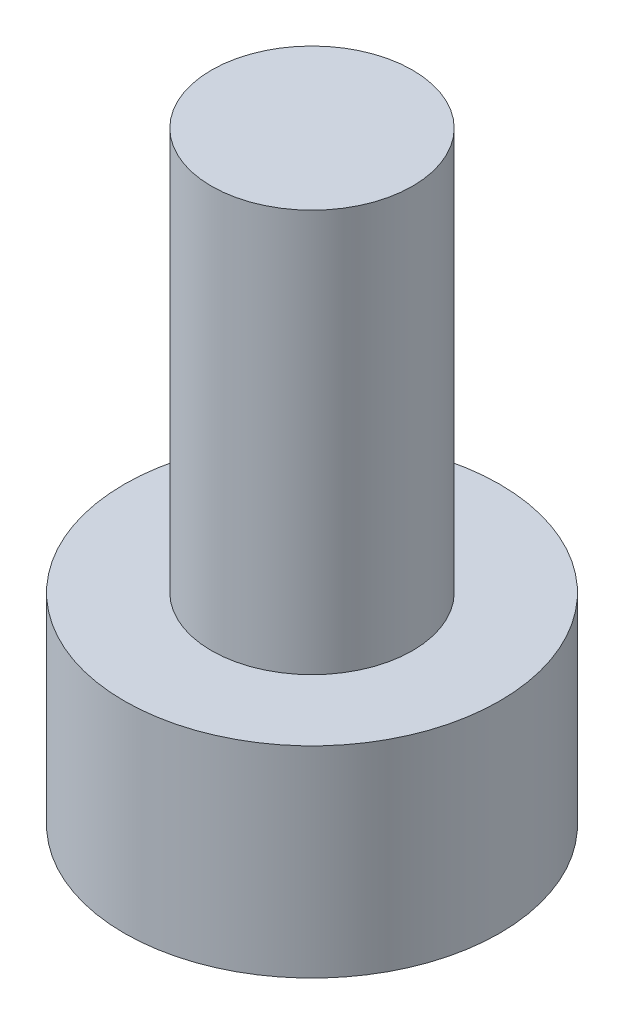
ISO-10303-21;
HEADER;
FILE_DESCRIPTION(('STEP AP214'),'2;1');
FILE_NAME('part.step','',(''),(''),'','','');
FILE_SCHEMA(('AUTOMOTIVE_DESIGN { 1 0 10303 214 1 1 1 1 }'));
ENDSEC;
DATA;
#1=APPLICATION_CONTEXT('core data for automotive mechanical design processes');
#2=APPLICATION_PROTOCOL_DEFINITION('international standard','automotive_design',2000,#1);
#3=PRODUCT_CONTEXT('',#1,'mechanical');
#4=PRODUCT('Part','Part','',(#3));
#5=PRODUCT_RELATED_PRODUCT_CATEGORY('part','',(#4));
#6=PRODUCT_DEFINITION_FORMATION('','',#4);
#7=PRODUCT_DEFINITION_CONTEXT('part definition',#1,'design');
#8=PRODUCT_DEFINITION('design','',#6,#7);
#9=PRODUCT_DEFINITION_SHAPE('','',#8);
#10=(LENGTH_UNIT() NAMED_UNIT(*) SI_UNIT(.MILLI.,.METRE.));
#11=(NAMED_UNIT(*) PLANE_ANGLE_UNIT() SI_UNIT($,.RADIAN.));
#12=(NAMED_UNIT(*) SI_UNIT($,.STERADIAN.) SOLID_ANGLE_UNIT());
#13=UNCERTAINTY_MEASURE_WITH_UNIT(LENGTH_MEASURE(1.E-05),#10,'distance_accuracy_value','');
#14=(GEOMETRIC_REPRESENTATION_CONTEXT(3) GLOBAL_UNCERTAINTY_ASSIGNED_CONTEXT((#13)) GLOBAL_UNIT_ASSIGNED_CONTEXT((#10,
#11,#12)) REPRESENTATION_CONTEXT('',''));
#15=CARTESIAN_POINT('',(0.,0.,0.));
#16=DIRECTION('',(0.,0.,1.));
#17=DIRECTION('',(1.,0.,0.));
#18=AXIS2_PLACEMENT_3D('',#15,#16,#17);
#19=CARTESIAN_POINT('',(0.,3.,0.));
#20=DIRECTION('',(0.,-1.,0.));
#21=DIRECTION('',(0.,0.,-1.));
#22=AXIS2_PLACEMENT_3D('',#19,#20,#21);
#23=CYLINDRICAL_SURFACE('',#22,2.8);
#24=CARTESIAN_POINT('',(0.,3.,0.));
#25=DIRECTION('',(0.,1.,0.));
#26=DIRECTION('',(0.,0.,1.));
#27=AXIS2_PLACEMENT_3D('',#24,#25,#26);
#28=CIRCLE('',#27,2.8);
#29=CARTESIAN_POINT('',(0.,3.,2.8));
#30=VERTEX_POINT('',#29);
#31=EDGE_CURVE('E47',#30,#30,#28,.T.);
#32=ORIENTED_EDGE('',*,*,#31,.F.);
#33=EDGE_LOOP('',(#32));
#34=FACE_BOUND('',#33,.T.);
#35=CARTESIAN_POINT('',(0.,0.,0.));
#36=DIRECTION('',(0.,1.,0.));
#37=DIRECTION('',(0.,0.,1.));
#38=AXIS2_PLACEMENT_3D('',#35,#36,#37);
#39=CIRCLE('',#38,2.8);
#40=CARTESIAN_POINT('',(0.,0.,2.8));
#41=VERTEX_POINT('',#40);
#42=EDGE_CURVE('E42',#41,#41,#39,.T.);
#43=ORIENTED_EDGE('',*,*,#42,.T.);
#44=EDGE_LOOP('',(#43));
#45=FACE_BOUND('',#44,.T.);
#46=ADVANCED_FACE('F39',(#34,#45),#23,.T.);
#47=CARTESIAN_POINT('',(0.,3.,0.));
#48=DIRECTION('',(0.,1.,0.));
#49=DIRECTION('',(0.,0.,1.));
#50=AXIS2_PLACEMENT_3D('',#47,#48,#49);
#51=PLANE('',#50);
#52=CARTESIAN_POINT('',(0.,3.,0.));
#53=DIRECTION('',(0.,1.,0.));
#54=DIRECTION('',(0.,0.,1.));
#55=AXIS2_PLACEMENT_3D('',#52,#53,#54);
#56=CIRCLE('',#55,1.5);
#57=CARTESIAN_POINT('',(0.,3.,1.5));
#58=VERTEX_POINT('',#57);
#59=EDGE_CURVE('E11',#58,#58,#56,.T.);
#60=ORIENTED_EDGE('',*,*,#59,.F.);
#61=EDGE_LOOP('',(#60));
#62=FACE_BOUND('',#61,.T.);
#63=ORIENTED_EDGE('',*,*,#31,.T.);
#64=EDGE_LOOP('',(#63));
#65=FACE_BOUND('',#64,.T.);
#66=ADVANCED_FACE('F159',(#62,#65),#51,.T.);
#67=CARTESIAN_POINT('',(0.,0.,0.));
#68=DIRECTION('',(0.,1.,0.));
#69=DIRECTION('',(0.,0.,1.));
#70=AXIS2_PLACEMENT_3D('',#67,#68,#69);
#71=PLANE('',#70);
#72=DIRECTION('',(-0.866025403784439,0.,-0.5));
#73=VECTOR('',#72,1.);
#74=CARTESIAN_POINT('',(0.,0.,1.44337567297407));
#75=LINE('',#74,#73);
#76=CARTESIAN_POINT('',(0.,0.,1.44337567297407));
#77=VERTEX_POINT('',#76);
#78=CARTESIAN_POINT('',(-1.25,0.,0.721687836487033));
#79=VERTEX_POINT('',#78);
#80=EDGE_CURVE('E129',#77,#79,#75,.T.);
#81=ORIENTED_EDGE('',*,*,#80,.F.);
#82=DIRECTION('',(-0.866025403784439,0.,0.5));
#83=VECTOR('',#82,1.);
#84=CARTESIAN_POINT('',(1.25,0.,0.721687836487033));
#85=LINE('',#84,#83);
#86=CARTESIAN_POINT('',(1.25,0.,0.721687836487033));
#87=VERTEX_POINT('',#86);
#88=EDGE_CURVE('E55',#87,#77,#85,.T.);
#89=ORIENTED_EDGE('',*,*,#88,.F.);
#90=DIRECTION('',(0.,0.,1.));
#91=VECTOR('',#90,1.);
#92=CARTESIAN_POINT('',(1.25,0.,-0.721687836487033));
#93=LINE('',#92,#91);
#94=CARTESIAN_POINT('',(1.25,0.,-0.721687836487033));
#95=VERTEX_POINT('',#94);
#96=EDGE_CURVE('E138',#95,#87,#93,.T.);
#97=ORIENTED_EDGE('',*,*,#96,.F.);
#98=DIRECTION('',(0.866025403784438,0.,0.5));
#99=VECTOR('',#98,1.);
#100=CARTESIAN_POINT('',(0.,0.,-1.44337567297407));
#101=LINE('',#100,#99);
#102=CARTESIAN_POINT('',(0.,0.,-1.44337567297407));
#103=VERTEX_POINT('',#102);
#104=EDGE_CURVE('E136',#103,#95,#101,.T.);
#105=ORIENTED_EDGE('',*,*,#104,.F.);
#106=DIRECTION('',(0.866025403784438,0.,-0.5));
#107=VECTOR('',#106,1.);
#108=CARTESIAN_POINT('',(-1.25,0.,-0.721687836487033));
#109=LINE('',#108,#107);
#110=CARTESIAN_POINT('',(-1.25,0.,-0.721687836487033));
#111=VERTEX_POINT('',#110);
#112=EDGE_CURVE('E103',#111,#103,#109,.T.);
#113=ORIENTED_EDGE('',*,*,#112,.F.);
#114=DIRECTION('',(0.,0.,-1.));
#115=VECTOR('',#114,1.);
#116=CARTESIAN_POINT('',(-1.25,0.,0.721687836487033));
#117=LINE('',#116,#115);
#118=EDGE_CURVE('E132',#79,#111,#117,.T.);
#119=ORIENTED_EDGE('',*,*,#118,.F.);
#120=EDGE_LOOP('',(#81,#89,#97,#105,#113,#119));
#121=FACE_BOUND('',#120,.T.);
#122=ORIENTED_EDGE('',*,*,#42,.F.);
#123=EDGE_LOOP('',(#122));
#124=FACE_BOUND('',#123,.T.);
#125=ADVANCED_FACE('F156',(#121,#124),#71,.F.);
#126=CARTESIAN_POINT('',(0.,9.,0.));
#127=DIRECTION('',(0.,-1.,0.));
#128=DIRECTION('',(0.,0.,-1.));
#129=AXIS2_PLACEMENT_3D('',#126,#127,#128);
#130=CYLINDRICAL_SURFACE('',#129,1.5);
#131=CARTESIAN_POINT('',(0.,9.,0.));
#132=DIRECTION('',(0.,1.,0.));
#133=DIRECTION('',(0.,0.,1.));
#134=AXIS2_PLACEMENT_3D('',#131,#132,#133);
#135=CIRCLE('',#134,1.5);
#136=CARTESIAN_POINT('',(0.,9.,1.5));
#137=VERTEX_POINT('',#136);
#138=EDGE_CURVE('E142',#137,#137,#135,.T.);
#139=ORIENTED_EDGE('',*,*,#138,.F.);
#140=EDGE_LOOP('',(#139));
#141=FACE_BOUND('',#140,.T.);
#142=ORIENTED_EDGE('',*,*,#59,.T.);
#143=EDGE_LOOP('',(#142));
#144=FACE_BOUND('',#143,.T.);
#145=ADVANCED_FACE('F158',(#141,#144),#130,.T.);
#146=CARTESIAN_POINT('',(0.,9.,0.));
#147=DIRECTION('',(0.,1.,0.));
#148=DIRECTION('',(0.,0.,1.));
#149=AXIS2_PLACEMENT_3D('',#146,#147,#148);
#150=PLANE('',#149);
#151=ORIENTED_EDGE('',*,*,#138,.T.);
#152=EDGE_LOOP('',(#151));
#153=FACE_BOUND('',#152,.T.);
#154=ADVANCED_FACE('F166',(#153),#150,.T.);
#155=CARTESIAN_POINT('',(1.25,1.,0.721687836487033));
#156=DIRECTION('',(0.5,0.,0.866025403784439));
#157=DIRECTION('',(0.866025403784439,0.,-0.5));
#158=AXIS2_PLACEMENT_3D('',#155,#156,#157);
#159=PLANE('',#158);
#160=ORIENTED_EDGE('',*,*,#88,.T.);
#161=DIRECTION('',(0.,-1.,0.));
#162=VECTOR('',#161,1.);
#163=CARTESIAN_POINT('',(0.,1.,1.44337567297407));
#164=LINE('',#163,#162);
#165=CARTESIAN_POINT('',(0.,1.,1.44337567297407));
#166=VERTEX_POINT('',#165);
#167=EDGE_CURVE('E85',#166,#77,#164,.T.);
#168=ORIENTED_EDGE('',*,*,#167,.F.);
#169=DIRECTION('',(-0.866025403784439,0.,0.5));
#170=VECTOR('',#169,1.);
#171=CARTESIAN_POINT('',(1.25,1.,0.721687836487033));
#172=LINE('',#171,#170);
#173=CARTESIAN_POINT('',(1.25,1.,0.721687836487033));
#174=VERTEX_POINT('',#173);
#175=EDGE_CURVE('E140',#174,#166,#172,.T.);
#176=ORIENTED_EDGE('',*,*,#175,.F.);
#177=DIRECTION('',(0.,-1.,0.));
#178=VECTOR('',#177,1.);
#179=CARTESIAN_POINT('',(1.25,1.,0.721687836487033));
#180=LINE('',#179,#178);
#181=EDGE_CURVE('E63',#174,#87,#180,.T.);
#182=ORIENTED_EDGE('',*,*,#181,.T.);
#183=EDGE_LOOP('',(#160,#168,#176,#182));
#184=FACE_BOUND('',#183,.T.);
#185=ADVANCED_FACE('F189',(#184),#159,.F.);
#186=CARTESIAN_POINT('',(1.25,1.,-0.721687836487033));
#187=DIRECTION('',(1.,0.,0.));
#188=DIRECTION('',(0.,0.,-1.));
#189=AXIS2_PLACEMENT_3D('',#186,#187,#188);
#190=PLANE('',#189);
#191=ORIENTED_EDGE('',*,*,#96,.T.);
#192=ORIENTED_EDGE('',*,*,#181,.F.);
#193=DIRECTION('',(0.,0.,1.));
#194=VECTOR('',#193,1.);
#195=CARTESIAN_POINT('',(1.25,1.,-0.721687836487033));
#196=LINE('',#195,#194);
#197=CARTESIAN_POINT('',(1.25,1.,-0.721687836487033));
#198=VERTEX_POINT('',#197);
#199=EDGE_CURVE('E115',#198,#174,#196,.T.);
#200=ORIENTED_EDGE('',*,*,#199,.F.);
#201=DIRECTION('',(0.,-1.,0.));
#202=VECTOR('',#201,1.);
#203=CARTESIAN_POINT('',(1.25,1.,-0.721687836487033));
#204=LINE('',#203,#202);
#205=EDGE_CURVE('E107',#198,#95,#204,.T.);
#206=ORIENTED_EDGE('',*,*,#205,.T.);
#207=EDGE_LOOP('',(#191,#192,#200,#206));
#208=FACE_BOUND('',#207,.T.);
#209=ADVANCED_FACE('F198',(#208),#190,.F.);
#210=CARTESIAN_POINT('',(0.,1.,-1.44337567297407));
#211=DIRECTION('',(0.5,0.,-0.866025403784439));
#212=DIRECTION('',(-0.866025403784438,0.,-0.5));
#213=AXIS2_PLACEMENT_3D('',#210,#211,#212);
#214=PLANE('',#213);
#215=ORIENTED_EDGE('',*,*,#104,.T.);
#216=ORIENTED_EDGE('',*,*,#205,.F.);
#217=DIRECTION('',(0.866025403784438,0.,0.5));
#218=VECTOR('',#217,1.);
#219=CARTESIAN_POINT('',(0.,1.,-1.44337567297407));
#220=LINE('',#219,#218);
#221=CARTESIAN_POINT('',(0.,1.,-1.44337567297407));
#222=VERTEX_POINT('',#221);
#223=EDGE_CURVE('E111',#222,#198,#220,.T.);
#224=ORIENTED_EDGE('',*,*,#223,.F.);
#225=DIRECTION('',(0.,-1.,0.));
#226=VECTOR('',#225,1.);
#227=CARTESIAN_POINT('',(0.,1.,-1.44337567297407));
#228=LINE('',#227,#226);
#229=EDGE_CURVE('E96',#222,#103,#228,.T.);
#230=ORIENTED_EDGE('',*,*,#229,.T.);
#231=EDGE_LOOP('',(#215,#216,#224,#230));
#232=FACE_BOUND('',#231,.T.);
#233=ADVANCED_FACE('F112',(#232),#214,.F.);
#234=CARTESIAN_POINT('',(-1.25,1.,-0.721687836487033));
#235=DIRECTION('',(-0.5,0.,-0.866025403784439));
#236=DIRECTION('',(-0.866025403784438,0.,0.5));
#237=AXIS2_PLACEMENT_3D('',#234,#235,#236);
#238=PLANE('',#237);
#239=ORIENTED_EDGE('',*,*,#112,.T.);
#240=ORIENTED_EDGE('',*,*,#229,.F.);
#241=DIRECTION('',(0.866025403784438,0.,-0.5));
#242=VECTOR('',#241,1.);
#243=CARTESIAN_POINT('',(-1.25,1.,-0.721687836487033));
#244=LINE('',#243,#242);
#245=CARTESIAN_POINT('',(-1.25,1.,-0.721687836487033));
#246=VERTEX_POINT('',#245);
#247=EDGE_CURVE('E100',#246,#222,#244,.T.);
#248=ORIENTED_EDGE('',*,*,#247,.F.);
#249=DIRECTION('',(0.,-1.,0.));
#250=VECTOR('',#249,1.);
#251=CARTESIAN_POINT('',(-1.25,1.,-0.721687836487033));
#252=LINE('',#251,#250);
#253=EDGE_CURVE('E108',#246,#111,#252,.T.);
#254=ORIENTED_EDGE('',*,*,#253,.T.);
#255=EDGE_LOOP('',(#239,#240,#248,#254));
#256=FACE_BOUND('',#255,.T.);
#257=ADVANCED_FACE('F98',(#256),#238,.F.);
#258=CARTESIAN_POINT('',(-1.25,1.,0.721687836487033));
#259=DIRECTION('',(-1.,0.,0.));
#260=DIRECTION('',(0.,0.,1.));
#261=AXIS2_PLACEMENT_3D('',#258,#259,#260);
#262=PLANE('',#261);
#263=ORIENTED_EDGE('',*,*,#118,.T.);
#264=ORIENTED_EDGE('',*,*,#253,.F.);
#265=DIRECTION('',(0.,0.,-1.));
#266=VECTOR('',#265,1.);
#267=CARTESIAN_POINT('',(-1.25,1.,0.721687836487033));
#268=LINE('',#267,#266);
#269=CARTESIAN_POINT('',(-1.25,1.,0.721687836487033));
#270=VERTEX_POINT('',#269);
#271=EDGE_CURVE('E121',#270,#246,#268,.T.);
#272=ORIENTED_EDGE('',*,*,#271,.F.);
#273=DIRECTION('',(0.,-1.,0.));
#274=VECTOR('',#273,1.);
#275=CARTESIAN_POINT('',(-1.25,1.,0.721687836487033));
#276=LINE('',#275,#274);
#277=EDGE_CURVE('E145',#270,#79,#276,.T.);
#278=ORIENTED_EDGE('',*,*,#277,.T.);
#279=EDGE_LOOP('',(#263,#264,#272,#278));
#280=FACE_BOUND('',#279,.T.);
#281=ADVANCED_FACE('F217',(#280),#262,.F.);
#282=CARTESIAN_POINT('',(0.,1.,1.44337567297407));
#283=DIRECTION('',(-0.5,0.,0.866025403784439));
#284=DIRECTION('',(0.866025403784439,0.,0.5));
#285=AXIS2_PLACEMENT_3D('',#282,#283,#284);
#286=PLANE('',#285);
#287=ORIENTED_EDGE('',*,*,#80,.T.);
#288=ORIENTED_EDGE('',*,*,#277,.F.);
#289=DIRECTION('',(-0.866025403784439,0.,-0.5));
#290=VECTOR('',#289,1.);
#291=CARTESIAN_POINT('',(0.,1.,1.44337567297407));
#292=LINE('',#291,#290);
#293=EDGE_CURVE('E123',#166,#270,#292,.T.);
#294=ORIENTED_EDGE('',*,*,#293,.F.);
#295=ORIENTED_EDGE('',*,*,#167,.T.);
#296=EDGE_LOOP('',(#287,#288,#294,#295));
#297=FACE_BOUND('',#296,.T.);
#298=ADVANCED_FACE('F224',(#297),#286,.F.);
#299=CARTESIAN_POINT('',(0.,1.,0.));
#300=DIRECTION('',(0.,-1.,0.));
#301=DIRECTION('',(0.,0.,-1.));
#302=AXIS2_PLACEMENT_3D('',#299,#300,#301);
#303=PLANE('',#302);
#304=ORIENTED_EDGE('',*,*,#175,.T.);
#305=ORIENTED_EDGE('',*,*,#293,.T.);
#306=ORIENTED_EDGE('',*,*,#271,.T.);
#307=ORIENTED_EDGE('',*,*,#247,.T.);
#308=ORIENTED_EDGE('',*,*,#223,.T.);
#309=ORIENTED_EDGE('',*,*,#199,.T.);
#310=EDGE_LOOP('',(#304,#305,#306,#307,#308,#309));
#311=FACE_BOUND('',#310,.T.);
#312=ADVANCED_FACE('F118',(#311),#303,.T.);
#313=CLOSED_SHELL('',(#46,#66,#125,#145,#154,#185,#209,#233,#257,#281,#298,#312));
#314=MANIFOLD_SOLID_BREP('B2',#313);
#315=ADVANCED_BREP_SHAPE_REPRESENTATION('',(#18,#314),#14);
#316=SHAPE_DEFINITION_REPRESENTATION(#9,#315);
ENDSEC;
END-ISO-10303-21;
